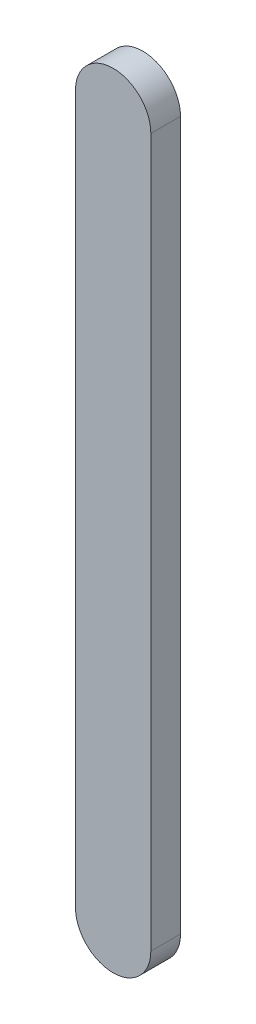
ISO-10303-21;
HEADER;
FILE_DESCRIPTION(('STEP AP214'),'2;1');
FILE_NAME('part.step','',(''),(''),'','','');
FILE_SCHEMA(('AUTOMOTIVE_DESIGN { 1 0 10303 214 1 1 1 1 }'));
ENDSEC;
DATA;
#1=APPLICATION_CONTEXT('core data for automotive mechanical design processes');
#2=APPLICATION_PROTOCOL_DEFINITION('international standard','automotive_design',2000,#1);
#3=PRODUCT_CONTEXT('',#1,'mechanical');
#4=PRODUCT('Part','Part','',(#3));
#5=PRODUCT_RELATED_PRODUCT_CATEGORY('part','',(#4));
#6=PRODUCT_DEFINITION_FORMATION('','',#4);
#7=PRODUCT_DEFINITION_CONTEXT('part definition',#1,'design');
#8=PRODUCT_DEFINITION('design','',#6,#7);
#9=PRODUCT_DEFINITION_SHAPE('','',#8);
#10=(LENGTH_UNIT() NAMED_UNIT(*) SI_UNIT(.MILLI.,.METRE.));
#11=(NAMED_UNIT(*) PLANE_ANGLE_UNIT() SI_UNIT($,.RADIAN.));
#12=(NAMED_UNIT(*) SI_UNIT($,.STERADIAN.) SOLID_ANGLE_UNIT());
#13=UNCERTAINTY_MEASURE_WITH_UNIT(LENGTH_MEASURE(1.E-05),#10,'distance_accuracy_value','');
#14=(GEOMETRIC_REPRESENTATION_CONTEXT(3) GLOBAL_UNCERTAINTY_ASSIGNED_CONTEXT((#13)) GLOBAL_UNIT_ASSIGNED_CONTEXT((#10,
#11,#12)) REPRESENTATION_CONTEXT('',''));
#15=CARTESIAN_POINT('',(0.,0.,0.));
#16=DIRECTION('',(0.,0.,1.));
#17=DIRECTION('',(1.,0.,0.));
#18=AXIS2_PLACEMENT_3D('',#15,#16,#17);
#19=CARTESIAN_POINT('',(151.3275104,70.6684896,0.));
#20=DIRECTION('',(-1.,0.,0.));
#21=DIRECTION('',(0.,1.,0.));
#22=AXIS2_PLACEMENT_3D('',#19,#20,#21);
#23=PLANE('',#22);
#24=DIRECTION('',(0.,1.,0.));
#25=VECTOR('',#24,1.);
#26=CARTESIAN_POINT('',(151.3275104,70.6684896,0.1999996));
#27=LINE('',#26,#25);
#28=CARTESIAN_POINT('',(151.3275104,70.6684896,0.1999996));
#29=VERTEX_POINT('',#28);
#30=CARTESIAN_POINT('',(151.3275104,75.4436896,0.1999996));
#31=VERTEX_POINT('',#30);
#32=EDGE_CURVE('E11',#29,#31,#27,.T.);
#33=ORIENTED_EDGE('',*,*,#32,.F.);
#34=DIRECTION('',(0.,0.,1.));
#35=VECTOR('',#34,1.);
#36=CARTESIAN_POINT('',(151.3275104,70.6684896,0.));
#37=LINE('',#36,#35);
#38=CARTESIAN_POINT('',(151.3275104,70.6684896,0.));
#39=VERTEX_POINT('',#38);
#40=EDGE_CURVE('E24',#39,#29,#37,.T.);
#41=ORIENTED_EDGE('',*,*,#40,.F.);
#42=DIRECTION('',(0.,1.,0.));
#43=VECTOR('',#42,1.);
#44=CARTESIAN_POINT('',(151.3275104,70.6684896,0.));
#45=LINE('',#44,#43);
#46=CARTESIAN_POINT('',(151.3275104,75.4436896,0.));
#47=VERTEX_POINT('',#46);
#48=EDGE_CURVE('E75',#39,#47,#45,.T.);
#49=ORIENTED_EDGE('',*,*,#48,.T.);
#50=DIRECTION('',(0.,0.,1.));
#51=VECTOR('',#50,1.);
#52=CARTESIAN_POINT('',(151.3275104,75.4436896,0.));
#53=LINE('',#52,#51);
#54=EDGE_CURVE('E37',#47,#31,#53,.T.);
#55=ORIENTED_EDGE('',*,*,#54,.T.);
#56=EDGE_LOOP('',(#33,#41,#49,#55));
#57=FACE_BOUND('',#56,.T.);
#58=ADVANCED_FACE('F17',(#57),#23,.F.);
#59=CARTESIAN_POINT('',(151.0735104,75.4436896,0.));
#60=DIRECTION('',(0.,0.,-1.));
#61=DIRECTION('',(1.,0.,0.));
#62=AXIS2_PLACEMENT_3D('',#59,#60,#61);
#63=CYLINDRICAL_SURFACE('',#62,0.253999999999986);
#64=CARTESIAN_POINT('',(151.0735104,75.4436896,0.1999996));
#65=DIRECTION('',(0.,0.,1.));
#66=DIRECTION('',(1.,0.,0.));
#67=AXIS2_PLACEMENT_3D('',#64,#65,#66);
#68=CIRCLE('',#67,0.253999999999986);
#69=CARTESIAN_POINT('',(150.8195104,75.4436896,0.1999996));
#70=VERTEX_POINT('',#69);
#71=EDGE_CURVE('E83',#31,#70,#68,.T.);
#72=ORIENTED_EDGE('',*,*,#71,.F.);
#73=ORIENTED_EDGE('',*,*,#54,.F.);
#74=CARTESIAN_POINT('',(151.0735104,75.4436896,0.));
#75=DIRECTION('',(0.,0.,1.));
#76=DIRECTION('',(1.,0.,0.));
#77=AXIS2_PLACEMENT_3D('',#74,#75,#76);
#78=CIRCLE('',#77,0.253999999999986);
#79=CARTESIAN_POINT('',(150.8195104,75.4436896,0.));
#80=VERTEX_POINT('',#79);
#81=EDGE_CURVE('E81',#47,#80,#78,.T.);
#82=ORIENTED_EDGE('',*,*,#81,.T.);
#83=DIRECTION('',(0.,0.,1.));
#84=VECTOR('',#83,1.);
#85=CARTESIAN_POINT('',(150.8195104,75.4436896,0.));
#86=LINE('',#85,#84);
#87=EDGE_CURVE('E67',#80,#70,#86,.T.);
#88=ORIENTED_EDGE('',*,*,#87,.T.);
#89=EDGE_LOOP('',(#72,#73,#82,#88));
#90=FACE_BOUND('',#89,.T.);
#91=ADVANCED_FACE('F89',(#90),#63,.T.);
#92=CARTESIAN_POINT('',(150.8195104,75.4436896,0.));
#93=DIRECTION('',(1.,0.,0.));
#94=DIRECTION('',(0.,-1.,0.));
#95=AXIS2_PLACEMENT_3D('',#92,#93,#94);
#96=PLANE('',#95);
#97=DIRECTION('',(0.,-1.,0.));
#98=VECTOR('',#97,1.);
#99=CARTESIAN_POINT('',(150.8195104,75.4436896,0.1999996));
#100=LINE('',#99,#98);
#101=CARTESIAN_POINT('',(150.8195104,70.6684896,0.1999996));
#102=VERTEX_POINT('',#101);
#103=EDGE_CURVE('E71',#70,#102,#100,.T.);
#104=ORIENTED_EDGE('',*,*,#103,.F.);
#105=ORIENTED_EDGE('',*,*,#87,.F.);
#106=DIRECTION('',(0.,-1.,0.));
#107=VECTOR('',#106,1.);
#108=CARTESIAN_POINT('',(150.8195104,75.4436896,0.));
#109=LINE('',#108,#107);
#110=CARTESIAN_POINT('',(150.8195104,70.6684896,0.));
#111=VERTEX_POINT('',#110);
#112=EDGE_CURVE('E63',#80,#111,#109,.T.);
#113=ORIENTED_EDGE('',*,*,#112,.T.);
#114=DIRECTION('',(0.,0.,1.));
#115=VECTOR('',#114,1.);
#116=CARTESIAN_POINT('',(150.8195104,70.6684896,0.));
#117=LINE('',#116,#115);
#118=EDGE_CURVE('E53',#111,#102,#117,.T.);
#119=ORIENTED_EDGE('',*,*,#118,.T.);
#120=EDGE_LOOP('',(#104,#105,#113,#119));
#121=FACE_BOUND('',#120,.T.);
#122=ADVANCED_FACE('F66',(#121),#96,.F.);
#123=CARTESIAN_POINT('',(151.0735104,70.6684896,0.));
#124=DIRECTION('',(0.,0.,-1.));
#125=DIRECTION('',(-1.,0.,0.));
#126=AXIS2_PLACEMENT_3D('',#123,#124,#125);
#127=CYLINDRICAL_SURFACE('',#126,0.253999999999991);
#128=CARTESIAN_POINT('',(151.0735104,70.6684896,0.1999996));
#129=DIRECTION('',(0.,0.,1.));
#130=DIRECTION('',(-1.,0.,0.));
#131=AXIS2_PLACEMENT_3D('',#128,#129,#130);
#132=CIRCLE('',#131,0.253999999999991);
#133=EDGE_CURVE('E59',#102,#29,#132,.T.);
#134=ORIENTED_EDGE('',*,*,#133,.F.);
#135=ORIENTED_EDGE('',*,*,#118,.F.);
#136=CARTESIAN_POINT('',(151.0735104,70.6684896,0.));
#137=DIRECTION('',(0.,0.,1.));
#138=DIRECTION('',(-1.,0.,0.));
#139=AXIS2_PLACEMENT_3D('',#136,#137,#138);
#140=CIRCLE('',#139,0.253999999999991);
#141=EDGE_CURVE('E57',#111,#39,#140,.T.);
#142=ORIENTED_EDGE('',*,*,#141,.T.);
#143=ORIENTED_EDGE('',*,*,#40,.T.);
#144=EDGE_LOOP('',(#134,#135,#142,#143));
#145=FACE_BOUND('',#144,.T.);
#146=ADVANCED_FACE('F55',(#145),#127,.T.);
#147=CARTESIAN_POINT('',(151.3275104,70.6684896,0.));
#148=DIRECTION('',(0.,0.,-1.));
#149=DIRECTION('',(-1.,0.,0.));
#150=AXIS2_PLACEMENT_3D('',#147,#148,#149);
#151=PLANE('',#150);
#152=ORIENTED_EDGE('',*,*,#141,.F.);
#153=ORIENTED_EDGE('',*,*,#112,.F.);
#154=ORIENTED_EDGE('',*,*,#81,.F.);
#155=ORIENTED_EDGE('',*,*,#48,.F.);
#156=EDGE_LOOP('',(#152,#153,#154,#155));
#157=FACE_BOUND('',#156,.T.);
#158=ADVANCED_FACE('F74',(#157),#151,.T.);
#159=CARTESIAN_POINT('',(151.3275104,70.6684896,0.1999996));
#160=DIRECTION('',(0.,0.,-1.));
#161=DIRECTION('',(-1.,0.,0.));
#162=AXIS2_PLACEMENT_3D('',#159,#160,#161);
#163=PLANE('',#162);
#164=ORIENTED_EDGE('',*,*,#32,.T.);
#165=ORIENTED_EDGE('',*,*,#71,.T.);
#166=ORIENTED_EDGE('',*,*,#103,.T.);
#167=ORIENTED_EDGE('',*,*,#133,.T.);
#168=EDGE_LOOP('',(#164,#165,#166,#167));
#169=FACE_BOUND('',#168,.T.);
#170=ADVANCED_FACE('F91',(#169),#163,.F.);
#171=CLOSED_SHELL('',(#58,#91,#122,#146,#158,#170));
#172=MANIFOLD_SOLID_BREP('B1',#171);
#173=ADVANCED_BREP_SHAPE_REPRESENTATION('',(#18,#172),#14);
#174=SHAPE_DEFINITION_REPRESENTATION(#9,#173);
ENDSEC;
END-ISO-10303-21;
